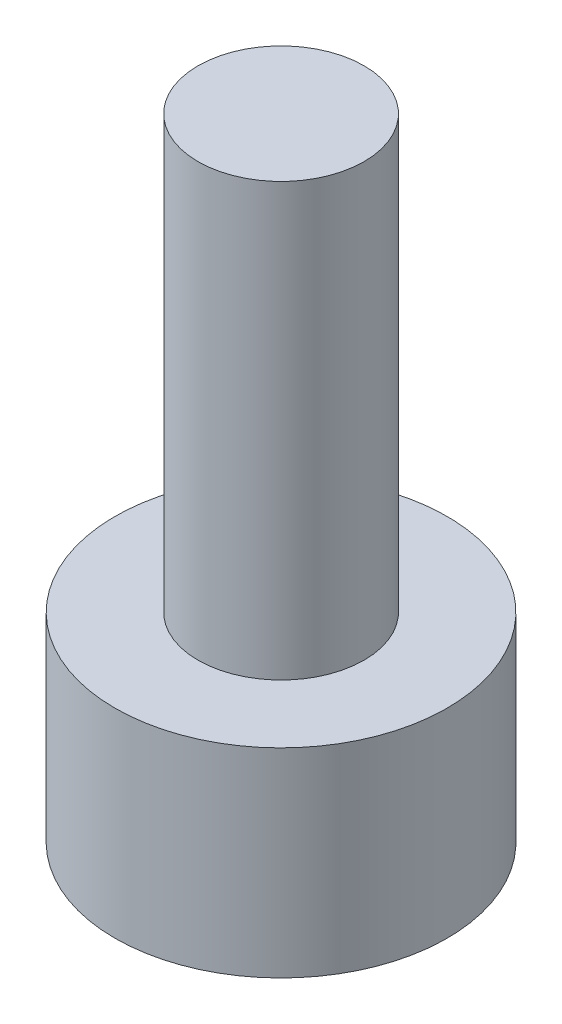
ISO-10303-21;
HEADER;
FILE_DESCRIPTION(('STEP AP214'),'2;1');
FILE_NAME('part.step','',(''),(''),'','','');
FILE_SCHEMA(('AUTOMOTIVE_DESIGN { 1 0 10303 214 1 1 1 1 }'));
ENDSEC;
DATA;
#1=APPLICATION_CONTEXT('core data for automotive mechanical design processes');
#2=APPLICATION_PROTOCOL_DEFINITION('international standard','automotive_design',2000,#1);
#3=PRODUCT_CONTEXT('',#1,'mechanical');
#4=PRODUCT('Part','Part','',(#3));
#5=PRODUCT_RELATED_PRODUCT_CATEGORY('part','',(#4));
#6=PRODUCT_DEFINITION_FORMATION('','',#4);
#7=PRODUCT_DEFINITION_CONTEXT('part definition',#1,'design');
#8=PRODUCT_DEFINITION('design','',#6,#7);
#9=PRODUCT_DEFINITION_SHAPE('','',#8);
#10=(LENGTH_UNIT() NAMED_UNIT(*) SI_UNIT(.MILLI.,.METRE.));
#11=(NAMED_UNIT(*) PLANE_ANGLE_UNIT() SI_UNIT($,.RADIAN.));
#12=(NAMED_UNIT(*) SI_UNIT($,.STERADIAN.) SOLID_ANGLE_UNIT());
#13=UNCERTAINTY_MEASURE_WITH_UNIT(LENGTH_MEASURE(1.E-05),#10,'distance_accuracy_value','');
#14=(GEOMETRIC_REPRESENTATION_CONTEXT(3) GLOBAL_UNCERTAINTY_ASSIGNED_CONTEXT((#13)) GLOBAL_UNIT_ASSIGNED_CONTEXT((#10,
#11,#12)) REPRESENTATION_CONTEXT('',''));
#15=CARTESIAN_POINT('',(0.,0.,0.));
#16=DIRECTION('',(0.,0.,1.));
#17=DIRECTION('',(1.,0.,0.));
#18=AXIS2_PLACEMENT_3D('',#15,#16,#17);
#19=CARTESIAN_POINT('',(0.,6.,0.));
#20=DIRECTION('',(0.,-1.,0.));
#21=DIRECTION('',(0.,0.,-1.));
#22=AXIS2_PLACEMENT_3D('',#19,#20,#21);
#23=CYLINDRICAL_SURFACE('',#22,5.);
#24=CARTESIAN_POINT('',(0.,6.,0.));
#25=DIRECTION('',(0.,1.,0.));
#26=DIRECTION('',(0.,0.,1.));
#27=AXIS2_PLACEMENT_3D('',#24,#25,#26);
#28=CIRCLE('',#27,5.);
#29=CARTESIAN_POINT('',(0.,6.,5.));
#30=VERTEX_POINT('',#29);
#31=EDGE_CURVE('E46',#30,#30,#28,.T.);
#32=ORIENTED_EDGE('',*,*,#31,.F.);
#33=EDGE_LOOP('',(#32));
#34=FACE_BOUND('',#33,.T.);
#35=CARTESIAN_POINT('',(0.,0.,0.));
#36=DIRECTION('',(0.,1.,0.));
#37=DIRECTION('',(0.,0.,1.));
#38=AXIS2_PLACEMENT_3D('',#35,#36,#37);
#39=CIRCLE('',#38,5.);
#40=CARTESIAN_POINT('',(0.,0.,5.));
#41=VERTEX_POINT('',#40);
#42=EDGE_CURVE('E45',#41,#41,#39,.T.);
#43=ORIENTED_EDGE('',*,*,#42,.T.);
#44=EDGE_LOOP('',(#43));
#45=FACE_BOUND('',#44,.T.);
#46=ADVANCED_FACE('F39',(#34,#45),#23,.T.);
#47=CARTESIAN_POINT('',(0.,6.,0.));
#48=DIRECTION('',(0.,1.,0.));
#49=DIRECTION('',(0.,0.,1.));
#50=AXIS2_PLACEMENT_3D('',#47,#48,#49);
#51=PLANE('',#50);
#52=CARTESIAN_POINT('',(0.,6.,0.));
#53=DIRECTION('',(0.,1.,0.));
#54=DIRECTION('',(0.,0.,1.));
#55=AXIS2_PLACEMENT_3D('',#52,#53,#54);
#56=CIRCLE('',#55,2.5);
#57=CARTESIAN_POINT('',(0.,6.,-2.5));
#58=VERTEX_POINT('',#57);
#59=EDGE_CURVE('E10',#58,#58,#56,.T.);
#60=ORIENTED_EDGE('',*,*,#59,.F.);
#61=EDGE_LOOP('',(#60));
#62=FACE_BOUND('',#61,.T.);
#63=ORIENTED_EDGE('',*,*,#31,.T.);
#64=EDGE_LOOP('',(#63));
#65=FACE_BOUND('',#64,.T.);
#66=ADVANCED_FACE('F61',(#62,#65),#51,.T.);
#67=CARTESIAN_POINT('',(0.,0.,0.));
#68=DIRECTION('',(0.,1.,0.));
#69=DIRECTION('',(0.,0.,1.));
#70=AXIS2_PLACEMENT_3D('',#67,#68,#69);
#71=PLANE('',#70);
#72=ORIENTED_EDGE('',*,*,#42,.F.);
#73=EDGE_LOOP('',(#72));
#74=FACE_BOUND('',#73,.T.);
#75=ADVANCED_FACE('F58',(#74),#71,.F.);
#76=CARTESIAN_POINT('',(0.,19.,0.));
#77=DIRECTION('',(0.,-1.,0.));
#78=DIRECTION('',(0.,0.,-1.));
#79=AXIS2_PLACEMENT_3D('',#76,#77,#78);
#80=CYLINDRICAL_SURFACE('',#79,2.5);
#81=CARTESIAN_POINT('',(0.,19.,0.));
#82=DIRECTION('',(0.,1.,0.));
#83=DIRECTION('',(0.,0.,1.));
#84=AXIS2_PLACEMENT_3D('',#81,#82,#83);
#85=CIRCLE('',#84,2.5);
#86=CARTESIAN_POINT('',(0.,19.,-2.5));
#87=VERTEX_POINT('',#86);
#88=EDGE_CURVE('E55',#87,#87,#85,.T.);
#89=CARTESIAN_POINT('',(0.,19.,-2.5));
#90=CARTESIAN_POINT('',(0.,18.8645833333333,-2.5));
#91=CARTESIAN_POINT('',(0.,18.7291666666667,-2.5));
#92=CARTESIAN_POINT('',(0.,18.4583333333333,-2.5));
#93=CARTESIAN_POINT('',(0.,18.3229166666667,-2.5));
#94=CARTESIAN_POINT('',(0.,18.0520833333333,-2.5));
#95=CARTESIAN_POINT('',(0.,17.9166666666667,-2.5));
#96=CARTESIAN_POINT('',(0.,17.6458333333333,-2.5));
#97=CARTESIAN_POINT('',(0.,17.5104166666667,-2.5));
#98=CARTESIAN_POINT('',(0.,17.2395833333333,-2.5));
#99=CARTESIAN_POINT('',(0.,17.1041666666667,-2.5));
#100=CARTESIAN_POINT('',(0.,16.8333333333333,-2.5));
#101=CARTESIAN_POINT('',(0.,16.6979166666667,-2.5));
#102=CARTESIAN_POINT('',(0.,16.4270833333333,-2.5));
#103=CARTESIAN_POINT('',(0.,16.2916666666667,-2.5));
#104=CARTESIAN_POINT('',(0.,16.0208333333333,-2.5));
#105=CARTESIAN_POINT('',(0.,15.8854166666667,-2.5));
#106=CARTESIAN_POINT('',(0.,15.6145833333333,-2.5));
#107=CARTESIAN_POINT('',(0.,15.4791666666667,-2.5));
#108=CARTESIAN_POINT('',(0.,15.2083333333333,-2.5));
#109=CARTESIAN_POINT('',(0.,15.0729166666667,-2.5));
#110=CARTESIAN_POINT('',(0.,14.8020833333333,-2.5));
#111=CARTESIAN_POINT('',(0.,14.6666666666667,-2.5));
#112=CARTESIAN_POINT('',(0.,14.3958333333333,-2.5));
#113=CARTESIAN_POINT('',(0.,14.2604166666667,-2.5));
#114=CARTESIAN_POINT('',(0.,13.9895833333333,-2.5));
#115=CARTESIAN_POINT('',(0.,13.8541666666667,-2.5));
#116=CARTESIAN_POINT('',(0.,13.5833333333333,-2.5));
#117=CARTESIAN_POINT('',(0.,13.4479166666667,-2.5));
#118=CARTESIAN_POINT('',(0.,13.1770833333333,-2.5));
#119=CARTESIAN_POINT('',(0.,13.0416666666667,-2.5));
#120=CARTESIAN_POINT('',(0.,12.7708333333333,-2.5));
#121=CARTESIAN_POINT('',(0.,12.6354166666667,-2.5));
#122=CARTESIAN_POINT('',(0.,12.3645833333333,-2.5));
#123=CARTESIAN_POINT('',(0.,12.2291666666667,-2.5));
#124=CARTESIAN_POINT('',(0.,11.9583333333333,-2.5));
#125=CARTESIAN_POINT('',(0.,11.8229166666667,-2.5));
#126=CARTESIAN_POINT('',(0.,11.5520833333333,-2.5));
#127=CARTESIAN_POINT('',(0.,11.4166666666667,-2.5));
#128=CARTESIAN_POINT('',(0.,11.1458333333333,-2.5));
#129=CARTESIAN_POINT('',(0.,11.0104166666667,-2.5));
#130=CARTESIAN_POINT('',(0.,10.7395833333333,-2.5));
#131=CARTESIAN_POINT('',(0.,10.6041666666667,-2.5));
#132=CARTESIAN_POINT('',(0.,10.3333333333333,-2.5));
#133=CARTESIAN_POINT('',(0.,10.1979166666667,-2.5));
#134=CARTESIAN_POINT('',(0.,9.92708333333333,-2.5));
#135=CARTESIAN_POINT('',(0.,9.79166666666667,-2.5));
#136=CARTESIAN_POINT('',(0.,9.52083333333333,-2.5));
#137=CARTESIAN_POINT('',(0.,9.38541666666667,-2.5));
#138=CARTESIAN_POINT('',(0.,9.11458333333333,-2.5));
#139=CARTESIAN_POINT('',(0.,8.97916666666667,-2.5));
#140=CARTESIAN_POINT('',(0.,8.70833333333333,-2.5));
#141=CARTESIAN_POINT('',(0.,8.57291666666667,-2.5));
#142=CARTESIAN_POINT('',(0.,8.30208333333333,-2.5));
#143=CARTESIAN_POINT('',(0.,8.16666666666667,-2.5));
#144=CARTESIAN_POINT('',(0.,7.89583333333333,-2.5));
#145=CARTESIAN_POINT('',(0.,7.76041666666667,-2.5));
#146=CARTESIAN_POINT('',(0.,7.48958333333333,-2.5));
#147=CARTESIAN_POINT('',(0.,7.35416666666667,-2.5));
#148=CARTESIAN_POINT('',(0.,7.08333333333333,-2.5));
#149=CARTESIAN_POINT('',(0.,6.94791666666667,-2.5));
#150=CARTESIAN_POINT('',(0.,6.67708333333333,-2.5));
#151=CARTESIAN_POINT('',(0.,6.54166666666667,-2.5));
#152=CARTESIAN_POINT('',(0.,6.27083333333333,-2.5));
#153=CARTESIAN_POINT('',(0.,6.13541666666667,-2.5));
#154=CARTESIAN_POINT('',(0.,6.,-2.5));
#155=B_SPLINE_CURVE_WITH_KNOTS('',3,(#89,#90,#91,#92,#93,#94,#95,#96,#97,#98,#99,#100,#101,#102,
#103,#104,#105,#106,#107,#108,#109,#110,#111,#112,#113,#114,#115,#116,#117,#118,#119,#120,#121,
#122,#123,#124,#125,#126,#127,#128,#129,#130,#131,#132,#133,#134,#135,#136,#137,#138,#139,#140,
#141,#142,#143,#144,#145,#146,#147,#148,#149,#150,#151,#152,#153,#154),.UNSPECIFIED.,.F.,.F.,(4,
2,2,2,2,2,2,2,2,2,2,2,2,2,2,2,2,2,2,2,2,2,2,2,2,2,2,2,2,2,2,2,4),(0.,0.40625,0.812500000000001,
1.21875,1.625,2.03125,2.4375,2.84375,3.25,3.65625,4.0625,4.46875,4.875,5.28125,5.6875,6.09375,
6.5,6.90625,7.3125,7.71875,8.125,8.53125,8.9375,9.34375,9.75,10.15625,10.5625,10.96875,11.375,
11.78125,12.1875,12.59375,13.),.UNSPECIFIED.);
#156=EDGE_CURVE('BSEAM65',#87,#58,#155,.T.);
#157=ORIENTED_EDGE('',*,*,#88,.F.);
#158=ORIENTED_EDGE('',*,*,#59,.T.);
#159=ORIENTED_EDGE('',*,*,#156,.T.);
#160=ORIENTED_EDGE('',*,*,#156,.F.);
#161=EDGE_LOOP('',(#157,#159,#158,#160));
#162=FACE_BOUND('',#161,.T.);
#163=ADVANCED_FACE('F65',(#162),#80,.T.);
#164=CARTESIAN_POINT('',(0.,19.,0.));
#165=DIRECTION('',(0.,1.,0.));
#166=DIRECTION('',(0.,0.,1.));
#167=AXIS2_PLACEMENT_3D('',#164,#165,#166);
#168=PLANE('',#167);
#169=ORIENTED_EDGE('',*,*,#88,.T.);
#170=EDGE_LOOP('',(#169));
#171=FACE_BOUND('',#170,.T.);
#172=ADVANCED_FACE('F69',(#171),#168,.T.);
#173=CLOSED_SHELL('',(#46,#66,#75,#163,#172));
#174=MANIFOLD_SOLID_BREP('B2',#173);
#175=ADVANCED_BREP_SHAPE_REPRESENTATION('',(#18,#174),#14);
#176=SHAPE_DEFINITION_REPRESENTATION(#9,#175);
ENDSEC;
END-ISO-10303-21;
